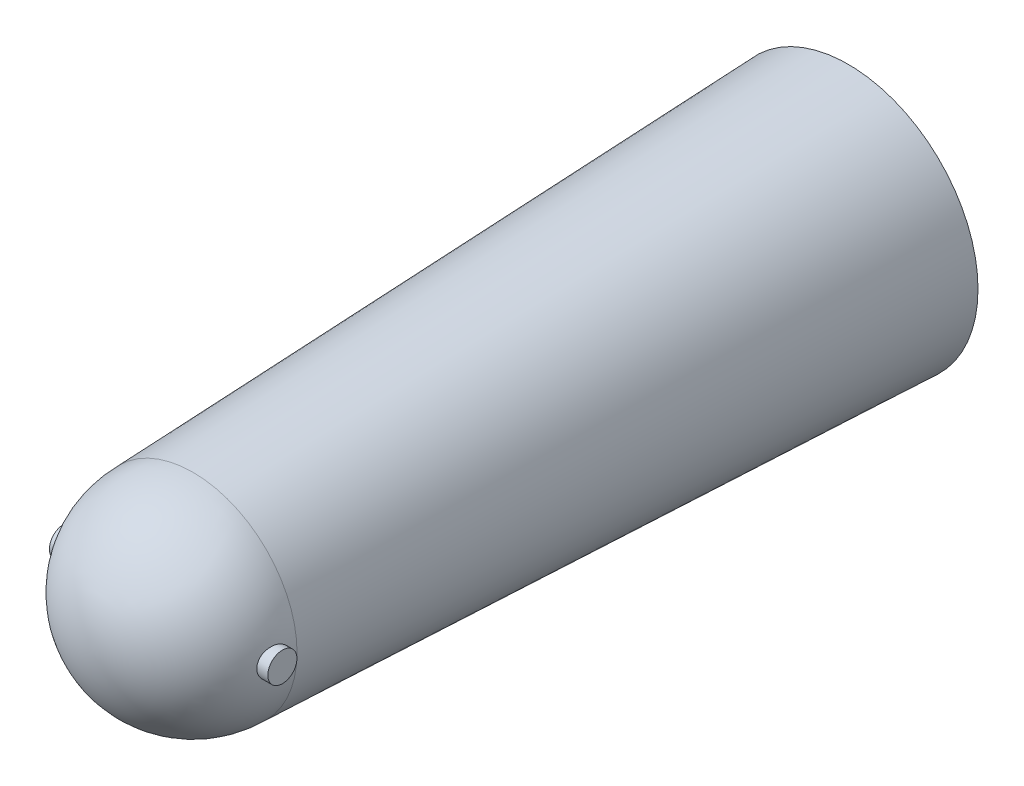
ISO-10303-21;
HEADER;
FILE_DESCRIPTION(('STEP AP214'),'2;1');
FILE_NAME('part.step','',(''),(''),'','','');
FILE_SCHEMA(('AUTOMOTIVE_DESIGN { 1 0 10303 214 1 1 1 1 }'));
ENDSEC;
DATA;
#1=APPLICATION_CONTEXT('core data for automotive mechanical design processes');
#2=APPLICATION_PROTOCOL_DEFINITION('international standard','automotive_design',2000,#1);
#3=PRODUCT_CONTEXT('',#1,'mechanical');
#4=PRODUCT('Part','Part','',(#3));
#5=PRODUCT_RELATED_PRODUCT_CATEGORY('part','',(#4));
#6=PRODUCT_DEFINITION_FORMATION('','',#4);
#7=PRODUCT_DEFINITION_CONTEXT('part definition',#1,'design');
#8=PRODUCT_DEFINITION('design','',#6,#7);
#9=PRODUCT_DEFINITION_SHAPE('','',#8);
#10=(LENGTH_UNIT() NAMED_UNIT(*) SI_UNIT(.MILLI.,.METRE.));
#11=(NAMED_UNIT(*) PLANE_ANGLE_UNIT() SI_UNIT($,.RADIAN.));
#12=(NAMED_UNIT(*) SI_UNIT($,.STERADIAN.) SOLID_ANGLE_UNIT());
#13=UNCERTAINTY_MEASURE_WITH_UNIT(LENGTH_MEASURE(1.E-05),#10,'distance_accuracy_value','');
#14=(GEOMETRIC_REPRESENTATION_CONTEXT(3) GLOBAL_UNCERTAINTY_ASSIGNED_CONTEXT((#13)) GLOBAL_UNIT_ASSIGNED_CONTEXT((#10,
#11,#12)) REPRESENTATION_CONTEXT('',''));
#15=CARTESIAN_POINT('',(0.,0.,0.));
#16=DIRECTION('',(0.,0.,1.));
#17=DIRECTION('',(1.,0.,0.));
#18=AXIS2_PLACEMENT_3D('',#15,#16,#17);
#19=CARTESIAN_POINT('',(75.,0.,463.622716312066));
#20=DIRECTION('',(-1.,0.,0.));
#21=DIRECTION('',(0.,0.,1.));
#22=AXIS2_PLACEMENT_3D('',#19,#20,#21);
#23=CYLINDRICAL_SURFACE('',#22,10.);
#24=CARTESIAN_POINT('',(75.,0.,463.622716312066));
#25=DIRECTION('',(1.,0.,0.));
#26=DIRECTION('',(0.,0.,-1.));
#27=AXIS2_PLACEMENT_3D('',#24,#25,#26);
#28=CIRCLE('',#27,10.);
#29=CARTESIAN_POINT('',(75.,0.,453.622716312066));
#30=VERTEX_POINT('',#29);
#31=EDGE_CURVE('E11',#30,#30,#28,.T.);
#32=ORIENTED_EDGE('',*,*,#31,.F.);
#33=EDGE_LOOP('',(#32));
#34=FACE_BOUND('',#33,.T.);
#35=CARTESIAN_POINT('',(65.,0.,463.622716312066));
#36=DIRECTION('',(1.,0.,0.));
#37=DIRECTION('',(0.,0.,-1.));
#38=AXIS2_PLACEMENT_3D('',#35,#36,#37);
#39=CIRCLE('',#38,10.);
#40=CARTESIAN_POINT('',(65.,0.,453.622716312066));
#41=VERTEX_POINT('',#40);
#42=EDGE_CURVE('E44',#41,#41,#39,.T.);
#43=ORIENTED_EDGE('',*,*,#42,.T.);
#44=EDGE_LOOP('',(#43));
#45=FACE_BOUND('',#44,.T.);
#46=ADVANCED_FACE('F41',(#34,#45),#23,.T.);
#47=CARTESIAN_POINT('',(75.,0.,463.622716312066));
#48=DIRECTION('',(1.,0.,0.));
#49=DIRECTION('',(0.,0.,-1.));
#50=AXIS2_PLACEMENT_3D('',#47,#48,#49);
#51=PLANE('',#50);
#52=ORIENTED_EDGE('',*,*,#31,.T.);
#53=EDGE_LOOP('',(#52));
#54=FACE_BOUND('',#53,.T.);
#55=ADVANCED_FACE('F56',(#54),#51,.T.);
#56=CARTESIAN_POINT('',(65.,0.,463.622716312066));
#57=DIRECTION('',(1.,0.,0.));
#58=DIRECTION('',(0.,0.,-1.));
#59=AXIS2_PLACEMENT_3D('',#56,#57,#58);
#60=PLANE('',#59);
#61=ORIENTED_EDGE('',*,*,#42,.F.);
#62=EDGE_LOOP('',(#61));
#63=FACE_BOUND('',#62,.T.);
#64=ADVANCED_FACE('F54',(#63),#60,.F.);
#65=CLOSED_SHELL('',(#46,#55,#64));
#66=MANIFOLD_SOLID_BREP('B2',#65);
#67=CARTESIAN_POINT('',(-75.,0.,463.622716312066));
#68=DIRECTION('',(1.,0.,0.));
#69=DIRECTION('',(0.,0.,-1.));
#70=AXIS2_PLACEMENT_3D('',#67,#68,#69);
#71=CYLINDRICAL_SURFACE('',#70,10.);
#72=CARTESIAN_POINT('',(-75.,0.,463.622716312066));
#73=DIRECTION('',(1.,0.,0.));
#74=DIRECTION('',(0.,0.,-1.));
#75=AXIS2_PLACEMENT_3D('',#72,#73,#74);
#76=CIRCLE('',#75,10.);
#77=CARTESIAN_POINT('',(-75.,0.,453.622716312066));
#78=VERTEX_POINT('',#77);
#79=EDGE_CURVE('E40',#78,#78,#76,.T.);
#80=ORIENTED_EDGE('',*,*,#79,.T.);
#81=EDGE_LOOP('',(#80));
#82=FACE_BOUND('',#81,.T.);
#83=CARTESIAN_POINT('',(-65.,0.,463.622716312066));
#84=DIRECTION('',(1.,0.,0.));
#85=DIRECTION('',(0.,0.,-1.));
#86=AXIS2_PLACEMENT_3D('',#83,#84,#85);
#87=CIRCLE('',#86,10.);
#88=CARTESIAN_POINT('',(-65.,0.,453.622716312066));
#89=VERTEX_POINT('',#88);
#90=EDGE_CURVE('E93',#89,#89,#87,.T.);
#91=ORIENTED_EDGE('',*,*,#90,.F.);
#92=EDGE_LOOP('',(#91));
#93=FACE_BOUND('',#92,.T.);
#94=ADVANCED_FACE('F90',(#82,#93),#71,.T.);
#95=CARTESIAN_POINT('',(-75.,0.,463.622716312066));
#96=DIRECTION('',(1.,0.,0.));
#97=DIRECTION('',(0.,0.,-1.));
#98=AXIS2_PLACEMENT_3D('',#95,#96,#97);
#99=PLANE('',#98);
#100=ORIENTED_EDGE('',*,*,#79,.F.);
#101=EDGE_LOOP('',(#100));
#102=FACE_BOUND('',#101,.T.);
#103=ADVANCED_FACE('F105',(#102),#99,.F.);
#104=CARTESIAN_POINT('',(-65.,0.,463.622716312066));
#105=DIRECTION('',(1.,0.,0.));
#106=DIRECTION('',(0.,0.,-1.));
#107=AXIS2_PLACEMENT_3D('',#104,#105,#106);
#108=PLANE('',#107);
#109=ORIENTED_EDGE('',*,*,#90,.T.);
#110=EDGE_LOOP('',(#109));
#111=FACE_BOUND('',#110,.T.);
#112=ADVANCED_FACE('F102',(#111),#108,.T.);
#113=CLOSED_SHELL('',(#94,#103,#112));
#114=MANIFOLD_SOLID_BREP('B6',#113);
#115=CARTESIAN_POINT('',(0.,0.,0.));
#116=DIRECTION('',(1.,0.,0.));
#117=DIRECTION('',(0.,1.,0.));
#118=AXIS2_PLACEMENT_3D('',#115,#116,#117);
#119=SPHERICAL_SURFACE('',#118,79.);
#120=CARTESIAN_POINT('',(0.,0.,0.));
#121=DIRECTION('',(0.,0.,1.));
#122=DIRECTION('',(1.,0.,0.));
#123=AXIS2_PLACEMENT_3D('',#120,#121,#122);
#124=CIRCLE('',#123,79.);
#125=CARTESIAN_POINT('',(79.,0.,0.));
#126=VERTEX_POINT('',#125);
#127=EDGE_CURVE('E196',#126,#126,#124,.T.);
#128=ORIENTED_EDGE('',*,*,#127,.F.);
#129=EDGE_LOOP('',(#128));
#130=FACE_BOUND('',#129,.T.);
#131=CARTESIAN_POINT('',(-75.,0.,0.));
#132=DIRECTION('',(1.,0.,0.));
#133=DIRECTION('',(0.,0.,-1.));
#134=AXIS2_PLACEMENT_3D('',#131,#132,#133);
#135=CIRCLE('',#134,24.8193472919817);
#136=CARTESIAN_POINT('',(-75.,-4.85197509276928,24.3404670805461));
#137=VERTEX_POINT('',#136);
#138=CARTESIAN_POINT('',(-75.,4.85197509276928,24.3404670805461));
#139=VERTEX_POINT('',#138);
#140=EDGE_CURVE('E193',#137,#139,#135,.F.);
#141=ORIENTED_EDGE('',*,*,#140,.F.);
#142=CARTESIAN_POINT('',(-75.0002,-4.85182892349148,24.3398799515768));
#143=CARTESIAN_POINT('',(-74.9510566173439,-4.88776624473021,24.4841491313131));
#144=CARTESIAN_POINT('',(-74.9013776566327,-4.917202915644,24.6298459088752));
#145=CARTESIAN_POINT('',(-74.8013089313394,-4.96299181079863,24.9230286852472));
#146=CARTESIAN_POINT('',(-74.7509192219204,-4.97934504485693,25.0705145450784));
#147=CARTESIAN_POINT('',(-74.6497832437597,-4.9988891862523,25.3662274630013));
#148=CARTESIAN_POINT('',(-74.5990369862731,-5.00208050721039,25.5144544976546));
#149=CARTESIAN_POINT('',(-74.4975437162063,-4.99529950297641,25.8106077601201));
#150=CARTESIAN_POINT('',(-74.4467967036237,-4.98532711667558,25.9585339865326));
#151=CARTESIAN_POINT('',(-74.3456544631691,-4.95226921475074,26.2530610372936));
#152=CARTESIAN_POINT('',(-74.2952592885003,-4.92918175761774,26.3996616621396));
#153=CARTESIAN_POINT('',(-74.1951729957933,-4.86999666184146,26.6905221982701));
#154=CARTESIAN_POINT('',(-74.1454821445423,-4.83389422333477,26.8347812254459));
#155=CARTESIAN_POINT('',(-74.0472193761968,-4.74888419665757,27.1197697758043));
#156=CARTESIAN_POINT('',(-73.9986468356399,-4.69998394109705,27.2605012696824));
#157=CARTESIAN_POINT('',(-73.9029465942704,-4.58959791712668,27.5375126523401));
#158=CARTESIAN_POINT('',(-73.855819386839,-4.52810790485001,27.6737910220113));
#159=CARTESIAN_POINT('',(-73.7637742977117,-4.39342022946197,27.9397136124768));
#160=CARTESIAN_POINT('',(-73.7188417357752,-4.3203203529315,28.0694022512907));
#161=CARTESIAN_POINT('',(-73.6311585898947,-4.16246940950726,28.3222609789944));
#162=CARTESIAN_POINT('',(-73.5884079070501,-4.07771887136086,28.4454313633541));
#163=CARTESIAN_POINT('',(-73.5054502647856,-3.89703780617313,28.6842469492325));
#164=CARTESIAN_POINT('',(-73.4652438467403,-3.80110491198331,28.7998905493327));
#165=CARTESIAN_POINT('',(-73.3877724162248,-3.59871143931552,29.02254741767));
#166=CARTESIAN_POINT('',(-73.3505061099911,-3.49225553835668,29.1295644823737));
#167=CARTESIAN_POINT('',(-73.2807558747659,-3.27416620016396,29.3297255225389));
#168=CARTESIAN_POINT('',(-73.2481369320319,-3.16293708351672,29.4232630693933));
#169=CARTESIAN_POINT('',(-73.1862398482288,-2.93221055389304,29.6006513404803));
#170=CARTESIAN_POINT('',(-73.1569602272474,-2.81271684161452,29.6845063559996));
#171=CARTESIAN_POINT('',(-73.1020235419833,-2.56626570268537,29.8417585517874));
#172=CARTESIAN_POINT('',(-73.0763660344283,-2.4393091920262,29.9151570117337));
#173=CARTESIAN_POINT('',(-73.0289417070514,-2.17885986562757,30.0507630122642));
#174=CARTESIAN_POINT('',(-73.0071746960342,-2.04536737150462,30.1129711027909));
#175=CARTESIAN_POINT('',(-72.9688984242015,-1.78067972184759,30.2223213215212));
#176=CARTESIAN_POINT('',(-72.9521598133628,-1.64978910467019,30.2701211848827));
#177=CARTESIAN_POINT('',(-72.922520777972,-1.38402584666979,30.3547378188403));
#178=CARTESIAN_POINT('',(-72.9096216755219,-1.24915185173697,30.391550806211));
#179=CARTESIAN_POINT('',(-72.8878133052922,-0.976569566107055,30.453778657309));
#180=CARTESIAN_POINT('',(-72.8789016013874,-0.838863059894578,30.4792004805506));
#181=CARTESIAN_POINT('',(-72.8651505110148,-0.561549938690057,30.5184233854456));
#182=CARTESIAN_POINT('',(-72.8603125844655,-0.421942660716521,30.5322203010854));
#183=CARTESIAN_POINT('',(-72.8548879302194,-0.148063368268516,30.5476902176448));
#184=CARTESIAN_POINT('',(-72.8541257844661,-0.0138228125965429,30.54986349057));
#185=CARTESIAN_POINT('',(-72.8563891494601,0.254415839859771,30.5434090743399));
#186=CARTESIAN_POINT('',(-72.8594160108548,0.38841383312418,30.5347775336497));
#187=CARTESIAN_POINT('',(-72.869226882469,0.655082335049607,30.5067964668362));
#188=CARTESIAN_POINT('',(-72.8760091393682,0.787753433805786,30.4874519423935));
#189=CARTESIAN_POINT('',(-72.893264975678,1.05093172064501,30.4382237689281));
#190=CARTESIAN_POINT('',(-72.9037399247766,1.18143808695602,30.4083362092955));
#191=CARTESIAN_POINT('',(-72.9281681470182,1.43816950887171,30.3386163530259));
#192=CARTESIAN_POINT('',(-72.9420895465579,1.56442237703743,30.2988751800785));
#193=CARTESIAN_POINT('',(-72.9733312335001,1.81305640724583,30.2096582317116));
#194=CARTESIAN_POINT('',(-72.990652743374,1.93543615832155,30.1601789550498));
#195=CARTESIAN_POINT('',(-73.0285281646336,2.17545230033179,30.0519411135739));
#196=CARTESIAN_POINT('',(-73.0490810715282,2.29309015107275,29.993185432339));
#197=CARTESIAN_POINT('',(-73.0932506658272,2.52298111893048,29.8668540923558));
#198=CARTESIAN_POINT('',(-73.1168685047137,2.63523219043542,29.7992751186747));
#199=CARTESIAN_POINT('',(-73.1676585217864,2.85666831458162,29.6538677290356));
#200=CARTESIAN_POINT('',(-73.1949107853222,2.96568333255178,29.5758079748907));
#201=CARTESIAN_POINT('',(-73.2522078647747,3.17666978648689,29.4115884523844));
#202=CARTESIAN_POINT('',(-73.2822537003734,3.27863862666422,29.3254257262236));
#203=CARTESIAN_POINT('',(-73.3762147150533,3.57304718189961,29.055791868243));
#204=CARTESIAN_POINT('',(-73.4439946797713,3.7541676146348,28.8610569697121));
#205=CARTESIAN_POINT('',(-73.5913986254369,4.09045223334644,28.4368946316794));
#206=CARTESIAN_POINT('',(-73.6714499093975,4.24382557026716,28.206205719821));
#207=CARTESIAN_POINT('',(-73.8382783409854,4.5098243468093,27.7245879865398));
#208=CARTESIAN_POINT('',(-73.9250577119952,4.62243624600262,27.4736524732444));
#209=CARTESIAN_POINT('',(-74.1076995860431,4.80965930041316,26.9445298990203));
#210=CARTESIAN_POINT('',(-74.2037997465263,4.88194720689308,26.6656034820377));
#211=CARTESIAN_POINT('',(-74.3981840218442,4.97766995284532,26.1002791468888));
#212=CARTESIAN_POINT('',(-74.496467432154,5.00112032701009,25.8138836339204));
#213=CARTESIAN_POINT('',(-74.6629607421049,4.99914672188019,25.3277620409495));
#214=CARTESIAN_POINT('',(-74.7313022457404,4.98632830572096,25.1279431794879));
#215=CARTESIAN_POINT('',(-74.8668103373867,4.93686626036463,24.7312076458122));
#216=CARTESIAN_POINT('',(-74.9339785024556,4.90025762341375,24.5342871448457));
#217=CARTESIAN_POINT('',(-75.0002,4.85182892349148,24.3398799515768));
#218=B_SPLINE_CURVE_WITH_KNOTS('',3,(#142,#143,#144,#145,#146,#147,#148,#149,#150,#151,#152,
#153,#154,#155,#156,#157,#158,#159,#160,#161,#162,#163,#164,#165,#166,#167,#168,#169,#170,#171,
#172,#173,#174,#175,#176,#177,#178,#179,#180,#181,#182,#183,#184,#185,#186,#187,#188,#189,#190,
#191,#192,#193,#194,#195,#196,#197,#198,#199,#200,#201,#202,#203,#204,#205,#206,#207,#208,#209,
#210,#211,#212,#213,#214,#215,#216,#217),.UNSPECIFIED.,.F.,.F.,(4,2,2,2,2,2,2,2,2,2,2,2,2,2,2,2,
2,2,2,2,2,2,2,2,2,2,2,2,2,2,2,2,2,2,2,2,2,4),(0.,0.469614334606375,0.939192419523745,
1.40875574755564,1.87832125540953,2.34795629421287,2.81776470967298,3.28730453177945,
3.75700289188913,4.22293663343584,4.68884923627212,5.15486064602085,5.62066583542013,
6.06693770897872,6.51301102995959,6.95902971331091,7.40502647141025,7.82554041989475,
8.24619900170564,8.66660022750844,9.08715204832744,9.48944878605867,9.89188896922893,
10.2941414192287,10.6965432293819,11.0953541333695,11.4943086888284,11.8931394721723,
12.292120530743,12.7021093382303,13.112248387718,13.9318796995483,14.7932381369708,
15.6548824446192,16.5620710524414,17.4689710492467,18.1023979445963,18.734895255692),.UNSPECIFIED.);
#219=EDGE_CURVE('E165',#137,#139,#218,.T.);
#220=ORIENTED_EDGE('',*,*,#219,.T.);
#221=EDGE_LOOP('',(#141,#220));
#222=FACE_BOUND('',#221,.T.);
#223=CARTESIAN_POINT('',(75.0002,-4.85182892349148,24.3398799515768));
#224=CARTESIAN_POINT('',(74.9510566173439,-4.88776624473021,24.4841491313131));
#225=CARTESIAN_POINT('',(74.9013776566327,-4.917202915644,24.6298459088752));
#226=CARTESIAN_POINT('',(74.8013089313394,-4.96299181079863,24.9230286852472));
#227=CARTESIAN_POINT('',(74.7509192219204,-4.97934504485693,25.0705145450784));
#228=CARTESIAN_POINT('',(74.6497832437597,-4.9988891862523,25.3662274630013));
#229=CARTESIAN_POINT('',(74.5990369862731,-5.00208050721039,25.5144544976546));
#230=CARTESIAN_POINT('',(74.4975437162063,-4.99529950297641,25.8106077601201));
#231=CARTESIAN_POINT('',(74.4467967036237,-4.98532711667558,25.9585339865326));
#232=CARTESIAN_POINT('',(74.3456544631691,-4.95226921475074,26.2530610372936));
#233=CARTESIAN_POINT('',(74.2952592885003,-4.92918175761774,26.3996616621396));
#234=CARTESIAN_POINT('',(74.1951729957933,-4.86999666184146,26.6905221982701));
#235=CARTESIAN_POINT('',(74.1454821445423,-4.83389422333477,26.8347812254459));
#236=CARTESIAN_POINT('',(74.0472193761968,-4.74888419665757,27.1197697758043));
#237=CARTESIAN_POINT('',(73.9986468356399,-4.69998394109705,27.2605012696824));
#238=CARTESIAN_POINT('',(73.9029465942704,-4.58959791712668,27.5375126523401));
#239=CARTESIAN_POINT('',(73.855819386839,-4.52810790485001,27.6737910220113));
#240=CARTESIAN_POINT('',(73.7637742977117,-4.39342022946197,27.9397136124768));
#241=CARTESIAN_POINT('',(73.7188417357752,-4.3203203529315,28.0694022512907));
#242=CARTESIAN_POINT('',(73.6311585898947,-4.16246940950726,28.3222609789944));
#243=CARTESIAN_POINT('',(73.5884079070501,-4.07771887136086,28.4454313633541));
#244=CARTESIAN_POINT('',(73.5054502647856,-3.89703780617313,28.6842469492325));
#245=CARTESIAN_POINT('',(73.4652438467403,-3.80110491198331,28.7998905493327));
#246=CARTESIAN_POINT('',(73.3877724162248,-3.59871143931552,29.02254741767));
#247=CARTESIAN_POINT('',(73.3505061099911,-3.49225553835668,29.1295644823737));
#248=CARTESIAN_POINT('',(73.2807558747659,-3.27416620016396,29.3297255225389));
#249=CARTESIAN_POINT('',(73.2481369320319,-3.16293708351672,29.4232630693933));
#250=CARTESIAN_POINT('',(73.1862398482288,-2.93221055389304,29.6006513404803));
#251=CARTESIAN_POINT('',(73.1569602272474,-2.81271684161452,29.6845063559996));
#252=CARTESIAN_POINT('',(73.1020235419833,-2.56626570268537,29.8417585517874));
#253=CARTESIAN_POINT('',(73.0763660344283,-2.4393091920262,29.9151570117337));
#254=CARTESIAN_POINT('',(73.0289417070514,-2.17885986562757,30.0507630122642));
#255=CARTESIAN_POINT('',(73.0071746960342,-2.04536737150462,30.1129711027909));
#256=CARTESIAN_POINT('',(72.9688984242015,-1.78067972184759,30.2223213215212));
#257=CARTESIAN_POINT('',(72.9521598133628,-1.64978910467019,30.2701211848827));
#258=CARTESIAN_POINT('',(72.922520777972,-1.38402584666979,30.3547378188403));
#259=CARTESIAN_POINT('',(72.9096216755219,-1.24915185173697,30.391550806211));
#260=CARTESIAN_POINT('',(72.8878133052922,-0.976569566107055,30.453778657309));
#261=CARTESIAN_POINT('',(72.8789016013874,-0.838863059894578,30.4792004805506));
#262=CARTESIAN_POINT('',(72.8651505110148,-0.561549938690057,30.5184233854456));
#263=CARTESIAN_POINT('',(72.8603125844655,-0.421942660716521,30.5322203010854));
#264=CARTESIAN_POINT('',(72.8548879302194,-0.148063368268516,30.5476902176448));
#265=CARTESIAN_POINT('',(72.8541257844661,-0.0138228125965429,30.54986349057));
#266=CARTESIAN_POINT('',(72.8563891494601,0.254415839859771,30.5434090743399));
#267=CARTESIAN_POINT('',(72.8594160108548,0.38841383312418,30.5347775336497));
#268=CARTESIAN_POINT('',(72.869226882469,0.655082335049607,30.5067964668362));
#269=CARTESIAN_POINT('',(72.8760091393682,0.787753433805786,30.4874519423935));
#270=CARTESIAN_POINT('',(72.893264975678,1.05093172064501,30.4382237689281));
#271=CARTESIAN_POINT('',(72.9037399247766,1.18143808695602,30.4083362092955));
#272=CARTESIAN_POINT('',(72.9281681470182,1.43816950887171,30.3386163530259));
#273=CARTESIAN_POINT('',(72.9420895465579,1.56442237703743,30.2988751800785));
#274=CARTESIAN_POINT('',(72.9733312335001,1.81305640724583,30.2096582317116));
#275=CARTESIAN_POINT('',(72.990652743374,1.93543615832155,30.1601789550498));
#276=CARTESIAN_POINT('',(73.0285281646336,2.17545230033179,30.0519411135739));
#277=CARTESIAN_POINT('',(73.0490810715282,2.29309015107275,29.993185432339));
#278=CARTESIAN_POINT('',(73.0932506658272,2.52298111893048,29.8668540923558));
#279=CARTESIAN_POINT('',(73.1168685047137,2.63523219043542,29.7992751186747));
#280=CARTESIAN_POINT('',(73.1676585217864,2.85666831458162,29.6538677290356));
#281=CARTESIAN_POINT('',(73.1949107853222,2.96568333255178,29.5758079748907));
#282=CARTESIAN_POINT('',(73.2522078647747,3.17666978648689,29.4115884523844));
#283=CARTESIAN_POINT('',(73.2822537003734,3.27863862666422,29.3254257262236));
#284=CARTESIAN_POINT('',(73.3762147150533,3.57304718189961,29.055791868243));
#285=CARTESIAN_POINT('',(73.4439946797713,3.7541676146348,28.8610569697121));
#286=CARTESIAN_POINT('',(73.5913986254369,4.09045223334644,28.4368946316794));
#287=CARTESIAN_POINT('',(73.6714499093975,4.24382557026716,28.206205719821));
#288=CARTESIAN_POINT('',(73.8382783409854,4.5098243468093,27.7245879865398));
#289=CARTESIAN_POINT('',(73.9250577119952,4.62243624600262,27.4736524732444));
#290=CARTESIAN_POINT('',(74.1076995860431,4.80965930041316,26.9445298990203));
#291=CARTESIAN_POINT('',(74.2037997465263,4.88194720689308,26.6656034820377));
#292=CARTESIAN_POINT('',(74.3981840218442,4.97766995284532,26.1002791468888));
#293=CARTESIAN_POINT('',(74.496467432154,5.00112032701009,25.8138836339204));
#294=CARTESIAN_POINT('',(74.6629607421049,4.99914672188019,25.3277620409495));
#295=CARTESIAN_POINT('',(74.7313022457404,4.98632830572096,25.1279431794879));
#296=CARTESIAN_POINT('',(74.8668103373867,4.93686626036463,24.7312076458122));
#297=CARTESIAN_POINT('',(74.9339785024556,4.90025762341375,24.5342871448457));
#298=CARTESIAN_POINT('',(75.0002,4.85182892349148,24.3398799515768));
#299=B_SPLINE_CURVE_WITH_KNOTS('',3,(#223,#224,#225,#226,#227,#228,#229,#230,#231,#232,#233,
#234,#235,#236,#237,#238,#239,#240,#241,#242,#243,#244,#245,#246,#247,#248,#249,#250,#251,#252,
#253,#254,#255,#256,#257,#258,#259,#260,#261,#262,#263,#264,#265,#266,#267,#268,#269,#270,#271,
#272,#273,#274,#275,#276,#277,#278,#279,#280,#281,#282,#283,#284,#285,#286,#287,#288,#289,#290,
#291,#292,#293,#294,#295,#296,#297,#298),.UNSPECIFIED.,.F.,.F.,(4,2,2,2,2,2,2,2,2,2,2,2,2,2,2,2,
2,2,2,2,2,2,2,2,2,2,2,2,2,2,2,2,2,2,2,2,2,4),(0.,0.469614334606375,0.939192419523745,
1.40875574755564,1.87832125540953,2.34795629421287,2.81776470967298,3.28730453177945,
3.75700289188913,4.22293663343584,4.68884923627212,5.15486064602085,5.62066583542013,
6.06693770897872,6.51301102995959,6.95902971331091,7.40502647141025,7.82554041989475,
8.24619900170564,8.66660022750844,9.08715204832744,9.48944878605867,9.89188896922893,
10.2941414192287,10.6965432293819,11.0953541333695,11.4943086888284,11.8931394721723,
12.292120530743,12.7021093382303,13.112248387718,13.9318796995483,14.7932381369708,
15.6548824446192,16.5620710524414,17.4689710492467,18.1023979445963,18.734895255692),.UNSPECIFIED.);
#300=CARTESIAN_POINT('',(75.,-4.85197509276928,24.3404670805461));
#301=VERTEX_POINT('',#300);
#302=CARTESIAN_POINT('',(75.,4.85197509276928,24.3404670805461));
#303=VERTEX_POINT('',#302);
#304=EDGE_CURVE('E88',#301,#303,#299,.T.);
#305=ORIENTED_EDGE('',*,*,#304,.F.);
#306=CARTESIAN_POINT('',(75.,0.,0.));
#307=DIRECTION('',(1.,0.,0.));
#308=DIRECTION('',(0.,0.,-1.));
#309=AXIS2_PLACEMENT_3D('',#306,#307,#308);
#310=CIRCLE('',#309,24.8193472919817);
#311=EDGE_CURVE('E144',#301,#303,#310,.F.);
#312=ORIENTED_EDGE('',*,*,#311,.T.);
#313=EDGE_LOOP('',(#305,#312));
#314=FACE_BOUND('',#313,.T.);
#315=ADVANCED_FACE('F130',(#130,#222,#314),#119,.F.);
#316=CARTESIAN_POINT('',(0.,0.,0.));
#317=DIRECTION('',(0.,0.,-1.));
#318=DIRECTION('',(1.,0.,0.));
#319=AXIS2_PLACEMENT_3D('',#316,#317,#318);
#320=CONICAL_SURFACE('',#319,89.125,0.0392699081698725);
#321=CARTESIAN_POINT('',(0.,0.,450.));
#322=DIRECTION('',(0.,0.,1.));
#323=DIRECTION('',(1.,0.,0.));
#324=AXIS2_PLACEMENT_3D('',#321,#322,#323);
#325=CIRCLE('',#324,71.4444518465486);
#326=CARTESIAN_POINT('',(71.4444518465486,0.,450.));
#327=VERTEX_POINT('',#326);
#328=EDGE_CURVE('E195',#327,#327,#325,.T.);
#329=ORIENTED_EDGE('',*,*,#328,.F.);
#330=EDGE_LOOP('',(#329));
#331=FACE_BOUND('',#330,.T.);
#332=CARTESIAN_POINT('',(0.,0.,0.));
#333=DIRECTION('',(0.,0.,1.));
#334=DIRECTION('',(1.,0.,0.));
#335=AXIS2_PLACEMENT_3D('',#332,#333,#334);
#336=CIRCLE('',#335,89.125);
#337=CARTESIAN_POINT('',(89.125,0.,0.));
#338=VERTEX_POINT('',#337);
#339=EDGE_CURVE('E199',#338,#338,#336,.T.);
#340=ORIENTED_EDGE('',*,*,#339,.T.);
#341=EDGE_LOOP('',(#340));
#342=FACE_BOUND('',#341,.T.);
#343=ADVANCED_FACE('F132',(#331,#342),#320,.T.);
#344=CARTESIAN_POINT('',(0.,0.,0.));
#345=DIRECTION('',(0.,0.,1.));
#346=DIRECTION('',(1.,0.,0.));
#347=AXIS2_PLACEMENT_3D('',#344,#345,#346);
#348=PLANE('',#347);
#349=ORIENTED_EDGE('',*,*,#127,.T.);
#350=EDGE_LOOP('',(#349));
#351=FACE_BOUND('',#350,.T.);
#352=ORIENTED_EDGE('',*,*,#339,.F.);
#353=EDGE_LOOP('',(#352));
#354=FACE_BOUND('',#353,.T.);
#355=ADVANCED_FACE('F174',(#351,#354),#348,.F.);
#356=CARTESIAN_POINT('',(0.,0.,450.));
#357=DIRECTION('',(0.,1.,0.));
#358=DIRECTION('',(1.,0.,0.));
#359=AXIS2_PLACEMENT_3D('',#356,#357,#358);
#360=SPHERICAL_SURFACE('',#359,71.4444518465486);
#361=CARTESIAN_POINT('',(0.,0.,450.));
#362=DIRECTION('',(0.,0.,1.));
#363=DIRECTION('',(1.,0.,0.));
#364=AXIS2_PLACEMENT_3D('',#361,#362,#363);
#365=SPHERICAL_SURFACE('',#364,71.4444518465486);
#366=ORIENTED_EDGE('',*,*,#328,.T.);
#367=EDGE_LOOP('',(#366));
#368=FACE_BOUND('',#367,.T.);
#369=ADVANCED_FACE('F184',(#368),#365,.T.);
#370=CARTESIAN_POINT('',(-75.,0.,25.5480836170122));
#371=DIRECTION('',(1.,0.,0.));
#372=DIRECTION('',(0.,0.,-1.));
#373=AXIS2_PLACEMENT_3D('',#370,#371,#372);
#374=CYLINDRICAL_SURFACE('',#373,5.);
#375=CARTESIAN_POINT('',(-75.,0.,25.5480836170122));
#376=DIRECTION('',(1.,0.,0.));
#377=DIRECTION('',(0.,0.,-1.));
#378=AXIS2_PLACEMENT_3D('',#375,#376,#377);
#379=CIRCLE('',#378,5.);
#380=EDGE_CURVE('E156',#139,#137,#379,.T.);
#381=ORIENTED_EDGE('',*,*,#380,.F.);
#382=ORIENTED_EDGE('',*,*,#219,.F.);
#383=EDGE_LOOP('',(#381,#382));
#384=FACE_BOUND('',#383,.T.);
#385=ADVANCED_FACE('F181',(#384),#374,.F.);
#386=CARTESIAN_POINT('',(-75.,0.,25.5480836170122));
#387=DIRECTION('',(1.,0.,0.));
#388=DIRECTION('',(0.,0.,-1.));
#389=AXIS2_PLACEMENT_3D('',#386,#387,#388);
#390=PLANE('',#389);
#391=ORIENTED_EDGE('',*,*,#140,.T.);
#392=ORIENTED_EDGE('',*,*,#380,.T.);
#393=EDGE_LOOP('',(#391,#392));
#394=FACE_BOUND('',#393,.T.);
#395=ADVANCED_FACE('F216',(#394),#390,.T.);
#396=CARTESIAN_POINT('',(75.,0.,25.5480836170122));
#397=DIRECTION('',(-1.,0.,0.));
#398=DIRECTION('',(0.,0.,1.));
#399=AXIS2_PLACEMENT_3D('',#396,#397,#398);
#400=CYLINDRICAL_SURFACE('',#399,5.);
#401=ORIENTED_EDGE('',*,*,#304,.T.);
#402=CARTESIAN_POINT('',(75.,0.,25.5480836170122));
#403=DIRECTION('',(1.,0.,0.));
#404=DIRECTION('',(0.,0.,-1.));
#405=AXIS2_PLACEMENT_3D('',#402,#403,#404);
#406=CIRCLE('',#405,5.);
#407=EDGE_CURVE('E150',#303,#301,#406,.T.);
#408=ORIENTED_EDGE('',*,*,#407,.T.);
#409=EDGE_LOOP('',(#401,#408));
#410=FACE_BOUND('',#409,.T.);
#411=ADVANCED_FACE('F167',(#410),#400,.F.);
#412=CARTESIAN_POINT('',(75.,0.,25.5480836170122));
#413=DIRECTION('',(1.,0.,0.));
#414=DIRECTION('',(0.,0.,-1.));
#415=AXIS2_PLACEMENT_3D('',#412,#413,#414);
#416=PLANE('',#415);
#417=ORIENTED_EDGE('',*,*,#407,.F.);
#418=ORIENTED_EDGE('',*,*,#311,.F.);
#419=EDGE_LOOP('',(#417,#418));
#420=FACE_BOUND('',#419,.T.);
#421=ADVANCED_FACE('F162',(#420),#416,.F.);
#422=CLOSED_SHELL('',(#315,#343,#355,#369,#385,#395,#411,#421));
#423=MANIFOLD_SOLID_BREP('B35',#422);
#424=ADVANCED_BREP_SHAPE_REPRESENTATION('',(#18,#66,#114,#423),#14);
#425=SHAPE_DEFINITION_REPRESENTATION(#9,#424);
ENDSEC;
END-ISO-10303-21;
